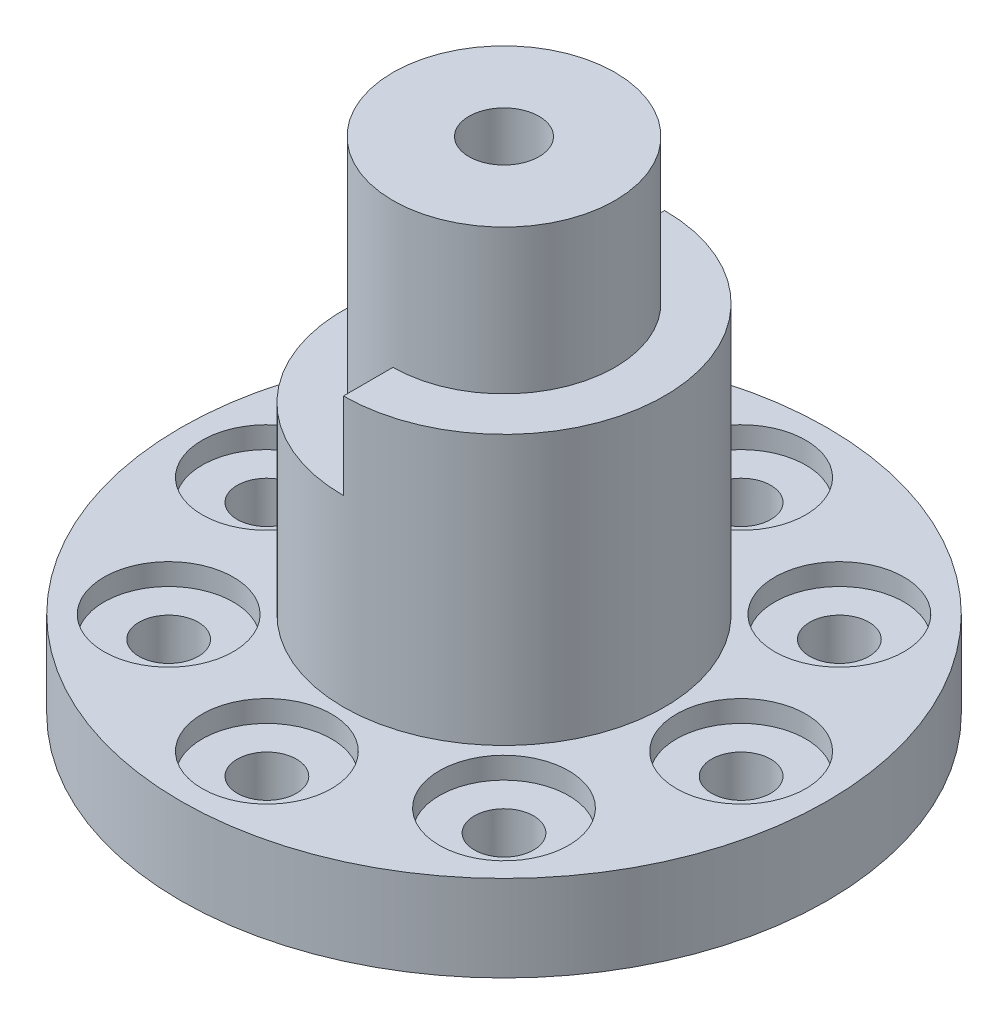
ISO-10303-21;
HEADER;
FILE_DESCRIPTION(('STEP AP214'),'2;1');
FILE_NAME('part.step','',(''),(''),'','','');
FILE_SCHEMA(('AUTOMOTIVE_DESIGN { 1 0 10303 214 1 1 1 1 }'));
ENDSEC;
DATA;
#1=APPLICATION_CONTEXT('core data for automotive mechanical design processes');
#2=APPLICATION_PROTOCOL_DEFINITION('international standard','automotive_design',2000,#1);
#3=PRODUCT_CONTEXT('',#1,'mechanical');
#4=PRODUCT('Part','Part','',(#3));
#5=PRODUCT_RELATED_PRODUCT_CATEGORY('part','',(#4));
#6=PRODUCT_DEFINITION_FORMATION('','',#4);
#7=PRODUCT_DEFINITION_CONTEXT('part definition',#1,'design');
#8=PRODUCT_DEFINITION('design','',#6,#7);
#9=PRODUCT_DEFINITION_SHAPE('','',#8);
#10=(LENGTH_UNIT() NAMED_UNIT(*) SI_UNIT(.MILLI.,.METRE.));
#11=(NAMED_UNIT(*) PLANE_ANGLE_UNIT() SI_UNIT($,.RADIAN.));
#12=(NAMED_UNIT(*) SI_UNIT($,.STERADIAN.) SOLID_ANGLE_UNIT());
#13=UNCERTAINTY_MEASURE_WITH_UNIT(LENGTH_MEASURE(1.E-05),#10,'distance_accuracy_value','');
#14=(GEOMETRIC_REPRESENTATION_CONTEXT(3) GLOBAL_UNCERTAINTY_ASSIGNED_CONTEXT((#13)) GLOBAL_UNIT_ASSIGNED_CONTEXT((#10,
#11,#12)) REPRESENTATION_CONTEXT('',''));
#15=CARTESIAN_POINT('',(0.,0.,0.));
#16=DIRECTION('',(0.,0.,1.));
#17=DIRECTION('',(1.,0.,0.));
#18=AXIS2_PLACEMENT_3D('',#15,#16,#17);
#19=CARTESIAN_POINT('',(0.,5.,0.));
#20=DIRECTION('',(0.,1.,0.));
#21=DIRECTION('',(0.,0.,1.));
#22=AXIS2_PLACEMENT_3D('',#19,#20,#21);
#23=PLANE('',#22);
#24=DIRECTION('',(0.,0.,1.));
#25=VECTOR('',#24,1.);
#26=CARTESIAN_POINT('',(0.,5.,0.));
#27=LINE('',#26,#25);
#28=CARTESIAN_POINT('',(0.,5.,-7.45));
#29=VERTEX_POINT('',#28);
#30=CARTESIAN_POINT('',(0.,5.,-5.15));
#31=VERTEX_POINT('',#30);
#32=EDGE_CURVE('E114',#29,#31,#27,.T.);
#33=ORIENTED_EDGE('',*,*,#32,.F.);
#34=CARTESIAN_POINT('',(0.,5.,0.));
#35=DIRECTION('',(0.,1.,0.));
#36=DIRECTION('',(0.,0.,1.));
#37=AXIS2_PLACEMENT_3D('',#34,#35,#36);
#38=CIRCLE('',#37,7.45);
#39=CARTESIAN_POINT('',(0.,5.,7.45));
#40=VERTEX_POINT('',#39);
#41=EDGE_CURVE('E98',#29,#40,#38,.T.);
#42=ORIENTED_EDGE('',*,*,#41,.T.);
#43=CARTESIAN_POINT('',(0.,5.,5.15));
#44=VERTEX_POINT('',#43);
#45=EDGE_CURVE('E96',#44,#40,#27,.T.);
#46=ORIENTED_EDGE('',*,*,#45,.F.);
#47=CARTESIAN_POINT('',(0.,5.,0.));
#48=DIRECTION('',(0.,1.,0.));
#49=DIRECTION('',(0.,0.,1.));
#50=AXIS2_PLACEMENT_3D('',#47,#48,#49);
#51=CIRCLE('',#50,5.15);
#52=EDGE_CURVE('E11',#44,#31,#51,.F.);
#53=ORIENTED_EDGE('',*,*,#52,.T.);
#54=EDGE_LOOP('',(#33,#42,#46,#53));
#55=FACE_BOUND('',#54,.T.);
#56=ADVANCED_FACE('F40',(#55),#23,.T.);
#57=CARTESIAN_POINT('',(0.,9.,0.));
#58=DIRECTION('',(1.,0.,0.));
#59=DIRECTION('',(0.,0.,-1.));
#60=AXIS2_PLACEMENT_3D('',#57,#58,#59);
#61=PLANE('',#60);
#62=DIRECTION('',(0.,1.,0.));
#63=VECTOR('',#62,1.);
#64=CARTESIAN_POINT('',(0.,-3.5,-7.45));
#65=LINE('',#64,#63);
#66=CARTESIAN_POINT('',(0.,9.,-7.45));
#67=VERTEX_POINT('',#66);
#68=EDGE_CURVE('E57',#29,#67,#65,.T.);
#69=ORIENTED_EDGE('',*,*,#68,.F.);
#70=ORIENTED_EDGE('',*,*,#32,.T.);
#71=DIRECTION('',(0.,-1.,0.));
#72=VECTOR('',#71,1.);
#73=CARTESIAN_POINT('',(0.,9.,-5.15));
#74=LINE('',#73,#72);
#75=CARTESIAN_POINT('',(0.,9.,-5.15));
#76=VERTEX_POINT('',#75);
#77=EDGE_CURVE('E108',#76,#31,#74,.T.);
#78=ORIENTED_EDGE('',*,*,#77,.F.);
#79=DIRECTION('',(0.,0.,1.));
#80=VECTOR('',#79,1.);
#81=CARTESIAN_POINT('',(0.,9.,0.));
#82=LINE('',#81,#80);
#83=EDGE_CURVE('E64',#67,#76,#82,.T.);
#84=ORIENTED_EDGE('',*,*,#83,.F.);
#85=EDGE_LOOP('',(#69,#70,#78,#84));
#86=FACE_BOUND('',#85,.T.);
#87=ADVANCED_FACE('F315',(#86),#61,.F.);
#88=DIRECTION('',(0.,1.,0.));
#89=VECTOR('',#88,1.);
#90=CARTESIAN_POINT('',(0.,-3.5,7.45));
#91=LINE('',#90,#89);
#92=CARTESIAN_POINT('',(0.,9.,7.45));
#93=VERTEX_POINT('',#92);
#94=EDGE_CURVE('E83',#93,#40,#91,.F.);
#95=ORIENTED_EDGE('',*,*,#94,.F.);
#96=CARTESIAN_POINT('',(0.,9.,5.15));
#97=VERTEX_POINT('',#96);
#98=EDGE_CURVE('E93',#97,#93,#82,.T.);
#99=ORIENTED_EDGE('',*,*,#98,.F.);
#100=DIRECTION('',(0.,-1.,0.));
#101=VECTOR('',#100,1.);
#102=CARTESIAN_POINT('',(0.,9.,5.15));
#103=LINE('',#102,#101);
#104=EDGE_CURVE('E104',#97,#44,#103,.T.);
#105=ORIENTED_EDGE('',*,*,#104,.T.);
#106=ORIENTED_EDGE('',*,*,#45,.T.);
#107=EDGE_LOOP('',(#95,#99,#105,#106));
#108=FACE_BOUND('',#107,.T.);
#109=ADVANCED_FACE('F92',(#108),#61,.F.);
#110=CARTESIAN_POINT('',(0.,9.,0.));
#111=DIRECTION('',(0.,1.,0.));
#112=DIRECTION('',(0.,0.,1.));
#113=AXIS2_PLACEMENT_3D('',#110,#111,#112);
#114=PLANE('',#113);
#115=ORIENTED_EDGE('',*,*,#98,.T.);
#116=CARTESIAN_POINT('',(0.,9.,0.));
#117=DIRECTION('',(0.,1.,0.));
#118=DIRECTION('',(0.,0.,1.));
#119=AXIS2_PLACEMENT_3D('',#116,#117,#118);
#120=CIRCLE('',#119,7.45);
#121=EDGE_CURVE('E80',#93,#67,#120,.T.);
#122=ORIENTED_EDGE('',*,*,#121,.T.);
#123=ORIENTED_EDGE('',*,*,#83,.T.);
#124=CARTESIAN_POINT('',(0.,9.,0.));
#125=DIRECTION('',(0.,1.,0.));
#126=DIRECTION('',(0.,0.,1.));
#127=AXIS2_PLACEMENT_3D('',#124,#125,#126);
#128=CIRCLE('',#127,5.15);
#129=EDGE_CURVE('E102',#76,#97,#128,.F.);
#130=ORIENTED_EDGE('',*,*,#129,.T.);
#131=EDGE_LOOP('',(#115,#122,#123,#130));
#132=FACE_BOUND('',#131,.T.);
#133=ADVANCED_FACE('F100',(#132),#114,.T.);
#134=CARTESIAN_POINT('',(-7.77817459305212,-7.5,-7.77817459305193));
#135=DIRECTION('',(0.,1.,0.));
#136=DIRECTION('',(0.,0.,1.));
#137=AXIS2_PLACEMENT_3D('',#134,#135,#136);
#138=CYLINDRICAL_SURFACE('',#137,1.375);
#139=CARTESIAN_POINT('',(-7.77817459305212,-7.5,-7.77817459305193));
#140=DIRECTION('',(0.,-1.,0.));
#141=DIRECTION('',(0.,0.,-1.));
#142=AXIS2_PLACEMENT_3D('',#139,#140,#141);
#143=CIRCLE('',#142,1.375);
#144=CARTESIAN_POINT('',(-7.77817459305212,-7.5,-9.15317459305193));
#145=VERTEX_POINT('',#144);
#146=EDGE_CURVE('E191',#145,#145,#143,.T.);
#147=ORIENTED_EDGE('',*,*,#146,.T.);
#148=EDGE_LOOP('',(#147));
#149=FACE_BOUND('',#148,.T.);
#150=CARTESIAN_POINT('',(-7.77817459305212,-4.5,-7.77817459305193));
#151=DIRECTION('',(0.,1.,0.));
#152=DIRECTION('',(0.,0.,1.));
#153=AXIS2_PLACEMENT_3D('',#150,#151,#152);
#154=CIRCLE('',#153,1.375);
#155=CARTESIAN_POINT('',(-7.77817459305212,-4.5,-6.40317459305193));
#156=VERTEX_POINT('',#155);
#157=EDGE_CURVE('E43',#156,#156,#154,.T.);
#158=ORIENTED_EDGE('',*,*,#157,.T.);
#159=EDGE_LOOP('',(#158));
#160=FACE_BOUND('',#159,.T.);
#161=ADVANCED_FACE('F343',(#149,#160),#138,.F.);
#162=CARTESIAN_POINT('',(-11.,-7.5,0.));
#163=DIRECTION('',(0.,1.,0.));
#164=DIRECTION('',(0.,0.,1.));
#165=AXIS2_PLACEMENT_3D('',#162,#163,#164);
#166=CYLINDRICAL_SURFACE('',#165,1.375);
#167=CARTESIAN_POINT('',(-11.,-7.5,0.));
#168=DIRECTION('',(0.,-1.,0.));
#169=DIRECTION('',(0.,0.,-1.));
#170=AXIS2_PLACEMENT_3D('',#167,#168,#169);
#171=CIRCLE('',#170,1.375);
#172=CARTESIAN_POINT('',(-11.,-7.5,-1.375));
#173=VERTEX_POINT('',#172);
#174=EDGE_CURVE('E196',#173,#173,#171,.T.);
#175=ORIENTED_EDGE('',*,*,#174,.T.);
#176=EDGE_LOOP('',(#175));
#177=FACE_BOUND('',#176,.T.);
#178=CARTESIAN_POINT('',(-11.,-4.5,0.));
#179=DIRECTION('',(0.,1.,0.));
#180=DIRECTION('',(0.,0.,1.));
#181=AXIS2_PLACEMENT_3D('',#178,#179,#180);
#182=CIRCLE('',#181,1.375);
#183=CARTESIAN_POINT('',(-11.,-4.5,1.375));
#184=VERTEX_POINT('',#183);
#185=EDGE_CURVE('E157',#184,#184,#182,.T.);
#186=ORIENTED_EDGE('',*,*,#185,.T.);
#187=EDGE_LOOP('',(#186));
#188=FACE_BOUND('',#187,.T.);
#189=ADVANCED_FACE('F373',(#177,#188),#166,.F.);
#190=CARTESIAN_POINT('',(-7.77817459305201,-7.5,7.77817459305203));
#191=DIRECTION('',(0.,1.,0.));
#192=DIRECTION('',(0.,0.,1.));
#193=AXIS2_PLACEMENT_3D('',#190,#191,#192);
#194=CYLINDRICAL_SURFACE('',#193,1.375);
#195=CARTESIAN_POINT('',(-7.77817459305201,-7.5,7.77817459305203));
#196=DIRECTION('',(0.,-1.,0.));
#197=DIRECTION('',(0.,0.,-1.));
#198=AXIS2_PLACEMENT_3D('',#195,#196,#197);
#199=CIRCLE('',#198,1.375);
#200=CARTESIAN_POINT('',(-7.77817459305201,-7.5,6.40317459305204));
#201=VERTEX_POINT('',#200);
#202=EDGE_CURVE('E202',#201,#201,#199,.T.);
#203=ORIENTED_EDGE('',*,*,#202,.T.);
#204=EDGE_LOOP('',(#203));
#205=FACE_BOUND('',#204,.T.);
#206=CARTESIAN_POINT('',(-7.77817459305201,-4.5,7.77817459305203));
#207=DIRECTION('',(0.,1.,0.));
#208=DIRECTION('',(0.,0.,1.));
#209=AXIS2_PLACEMENT_3D('',#206,#207,#208);
#210=CIRCLE('',#209,1.375);
#211=CARTESIAN_POINT('',(-7.77817459305201,-4.5,9.15317459305203));
#212=VERTEX_POINT('',#211);
#213=EDGE_CURVE('E154',#212,#212,#210,.T.);
#214=ORIENTED_EDGE('',*,*,#213,.T.);
#215=EDGE_LOOP('',(#214));
#216=FACE_BOUND('',#215,.T.);
#217=ADVANCED_FACE('F369',(#205,#216),#194,.F.);
#218=CARTESIAN_POINT('',(0.,-7.5,11.));
#219=DIRECTION('',(0.,1.,0.));
#220=DIRECTION('',(0.,0.,1.));
#221=AXIS2_PLACEMENT_3D('',#218,#219,#220);
#222=CYLINDRICAL_SURFACE('',#221,1.375);
#223=CARTESIAN_POINT('',(0.,-7.5,11.));
#224=DIRECTION('',(0.,-1.,0.));
#225=DIRECTION('',(0.,0.,-1.));
#226=AXIS2_PLACEMENT_3D('',#223,#224,#225);
#227=CIRCLE('',#226,1.375);
#228=CARTESIAN_POINT('',(0.,-7.5,9.625));
#229=VERTEX_POINT('',#228);
#230=EDGE_CURVE('E206',#229,#229,#227,.T.);
#231=ORIENTED_EDGE('',*,*,#230,.T.);
#232=EDGE_LOOP('',(#231));
#233=FACE_BOUND('',#232,.T.);
#234=CARTESIAN_POINT('',(0.,-4.5,11.));
#235=DIRECTION('',(0.,1.,0.));
#236=DIRECTION('',(0.,0.,1.));
#237=AXIS2_PLACEMENT_3D('',#234,#235,#236);
#238=CIRCLE('',#237,1.375);
#239=CARTESIAN_POINT('',(0.,-4.5,12.375));
#240=VERTEX_POINT('',#239);
#241=EDGE_CURVE('E150',#240,#240,#238,.T.);
#242=ORIENTED_EDGE('',*,*,#241,.T.);
#243=EDGE_LOOP('',(#242));
#244=FACE_BOUND('',#243,.T.);
#245=ADVANCED_FACE('F365',(#233,#244),#222,.F.);
#246=CARTESIAN_POINT('',(7.77817459305206,-7.5,7.77817459305199));
#247=DIRECTION('',(0.,1.,0.));
#248=DIRECTION('',(0.,0.,1.));
#249=AXIS2_PLACEMENT_3D('',#246,#247,#248);
#250=CYLINDRICAL_SURFACE('',#249,1.375);
#251=CARTESIAN_POINT('',(7.77817459305206,-7.5,7.77817459305199));
#252=DIRECTION('',(0.,-1.,0.));
#253=DIRECTION('',(0.,0.,-1.));
#254=AXIS2_PLACEMENT_3D('',#251,#252,#253);
#255=CIRCLE('',#254,1.375);
#256=CARTESIAN_POINT('',(7.77817459305206,-7.5,6.40317459305199));
#257=VERTEX_POINT('',#256);
#258=EDGE_CURVE('E210',#257,#257,#255,.T.);
#259=ORIENTED_EDGE('',*,*,#258,.T.);
#260=EDGE_LOOP('',(#259));
#261=FACE_BOUND('',#260,.T.);
#262=CARTESIAN_POINT('',(7.77817459305206,-4.5,7.77817459305199));
#263=DIRECTION('',(0.,1.,0.));
#264=DIRECTION('',(0.,0.,1.));
#265=AXIS2_PLACEMENT_3D('',#262,#263,#264);
#266=CIRCLE('',#265,1.375);
#267=CARTESIAN_POINT('',(7.77817459305206,-4.5,9.15317459305198));
#268=VERTEX_POINT('',#267);
#269=EDGE_CURVE('E146',#268,#268,#266,.T.);
#270=ORIENTED_EDGE('',*,*,#269,.T.);
#271=EDGE_LOOP('',(#270));
#272=FACE_BOUND('',#271,.T.);
#273=ADVANCED_FACE('F361',(#261,#272),#250,.F.);
#274=CARTESIAN_POINT('',(11.,-7.5,0.));
#275=DIRECTION('',(0.,1.,0.));
#276=DIRECTION('',(0.,0.,1.));
#277=AXIS2_PLACEMENT_3D('',#274,#275,#276);
#278=CYLINDRICAL_SURFACE('',#277,1.375);
#279=CARTESIAN_POINT('',(11.,-7.5,0.));
#280=DIRECTION('',(0.,-1.,0.));
#281=DIRECTION('',(0.,0.,-1.));
#282=AXIS2_PLACEMENT_3D('',#279,#280,#281);
#283=CIRCLE('',#282,1.375);
#284=CARTESIAN_POINT('',(11.,-7.5,-1.37500000000008));
#285=VERTEX_POINT('',#284);
#286=EDGE_CURVE('E214',#285,#285,#283,.T.);
#287=ORIENTED_EDGE('',*,*,#286,.T.);
#288=EDGE_LOOP('',(#287));
#289=FACE_BOUND('',#288,.T.);
#290=CARTESIAN_POINT('',(11.,-4.5,0.));
#291=DIRECTION('',(0.,1.,0.));
#292=DIRECTION('',(0.,0.,1.));
#293=AXIS2_PLACEMENT_3D('',#290,#291,#292);
#294=CIRCLE('',#293,1.375);
#295=CARTESIAN_POINT('',(11.,-4.5,1.37499999999992));
#296=VERTEX_POINT('',#295);
#297=EDGE_CURVE('E142',#296,#296,#294,.T.);
#298=ORIENTED_EDGE('',*,*,#297,.T.);
#299=EDGE_LOOP('',(#298));
#300=FACE_BOUND('',#299,.T.);
#301=ADVANCED_FACE('F357',(#289,#300),#278,.F.);
#302=CARTESIAN_POINT('',(7.77817459305195,-7.5,-7.77817459305209));
#303=DIRECTION('',(0.,1.,0.));
#304=DIRECTION('',(0.,0.,1.));
#305=AXIS2_PLACEMENT_3D('',#302,#303,#304);
#306=CYLINDRICAL_SURFACE('',#305,1.375);
#307=CARTESIAN_POINT('',(7.77817459305195,-7.5,-7.77817459305209));
#308=DIRECTION('',(0.,-1.,0.));
#309=DIRECTION('',(0.,0.,-1.));
#310=AXIS2_PLACEMENT_3D('',#307,#308,#309);
#311=CIRCLE('',#310,1.375);
#312=CARTESIAN_POINT('',(7.77817459305195,-7.5,-9.15317459305209));
#313=VERTEX_POINT('',#312);
#314=EDGE_CURVE('E175',#313,#313,#311,.T.);
#315=ORIENTED_EDGE('',*,*,#314,.T.);
#316=EDGE_LOOP('',(#315));
#317=FACE_BOUND('',#316,.T.);
#318=CARTESIAN_POINT('',(7.77817459305195,-4.5,-7.77817459305209));
#319=DIRECTION('',(0.,1.,0.));
#320=DIRECTION('',(0.,0.,1.));
#321=AXIS2_PLACEMENT_3D('',#318,#319,#320);
#322=CIRCLE('',#321,1.375);
#323=CARTESIAN_POINT('',(7.77817459305195,-4.5,-6.40317459305209));
#324=VERTEX_POINT('',#323);
#325=EDGE_CURVE('E137',#324,#324,#322,.T.);
#326=ORIENTED_EDGE('',*,*,#325,.T.);
#327=EDGE_LOOP('',(#326));
#328=FACE_BOUND('',#327,.T.);
#329=ADVANCED_FACE('F353',(#317,#328),#306,.F.);
#330=CARTESIAN_POINT('',(-1.15218884181823E-13,-7.5,-11.));
#331=DIRECTION('',(0.,1.,0.));
#332=DIRECTION('',(0.,0.,1.));
#333=AXIS2_PLACEMENT_3D('',#330,#331,#332);
#334=CYLINDRICAL_SURFACE('',#333,1.375);
#335=CARTESIAN_POINT('',(-1.15218884181823E-13,-7.5,-11.));
#336=DIRECTION('',(0.,-1.,0.));
#337=DIRECTION('',(0.,0.,-1.));
#338=AXIS2_PLACEMENT_3D('',#335,#336,#337);
#339=CIRCLE('',#338,1.375);
#340=CARTESIAN_POINT('',(-1.15218884181823E-13,-7.5,-12.375));
#341=VERTEX_POINT('',#340);
#342=EDGE_CURVE('E169',#341,#341,#339,.T.);
#343=ORIENTED_EDGE('',*,*,#342,.T.);
#344=EDGE_LOOP('',(#343));
#345=FACE_BOUND('',#344,.T.);
#346=CARTESIAN_POINT('',(-1.15218884181823E-13,-4.5,-11.));
#347=DIRECTION('',(0.,1.,0.));
#348=DIRECTION('',(0.,0.,1.));
#349=AXIS2_PLACEMENT_3D('',#346,#347,#348);
#350=CIRCLE('',#349,1.375);
#351=CARTESIAN_POINT('',(-1.15218884181823E-13,-4.5,-9.625));
#352=VERTEX_POINT('',#351);
#353=EDGE_CURVE('E133',#352,#352,#350,.T.);
#354=ORIENTED_EDGE('',*,*,#353,.T.);
#355=EDGE_LOOP('',(#354));
#356=FACE_BOUND('',#355,.T.);
#357=ADVANCED_FACE('F337',(#345,#356),#334,.F.);
#358=CARTESIAN_POINT('',(0.,37.,0.));
#359=DIRECTION('',(0.,-1.,0.));
#360=DIRECTION('',(0.,0.,-1.));
#361=AXIS2_PLACEMENT_3D('',#358,#359,#360);
#362=CYLINDRICAL_SURFACE('',#361,1.625);
#363=CARTESIAN_POINT('',(0.,15.7,0.));
#364=DIRECTION('',(0.,1.,0.));
#365=DIRECTION('',(0.,0.,1.));
#366=AXIS2_PLACEMENT_3D('',#363,#364,#365);
#367=CIRCLE('',#366,1.625);
#368=CARTESIAN_POINT('',(0.,15.7,1.625));
#369=VERTEX_POINT('',#368);
#370=EDGE_CURVE('E117',#369,#369,#367,.T.);
#371=ORIENTED_EDGE('',*,*,#370,.T.);
#372=EDGE_LOOP('',(#371));
#373=FACE_BOUND('',#372,.T.);
#374=CARTESIAN_POINT('',(0.,10.7,0.));
#375=DIRECTION('',(0.,-1.,0.));
#376=DIRECTION('',(0.,0.,-1.));
#377=AXIS2_PLACEMENT_3D('',#374,#375,#376);
#378=CIRCLE('',#377,1.625);
#379=CARTESIAN_POINT('',(0.,10.7,-1.625));
#380=VERTEX_POINT('',#379);
#381=EDGE_CURVE('E128',#380,#380,#378,.F.);
#382=ORIENTED_EDGE('',*,*,#381,.F.);
#383=EDGE_LOOP('',(#382));
#384=FACE_BOUND('',#383,.T.);
#385=ADVANCED_FACE('F328',(#373,#384),#362,.F.);
#386=CARTESIAN_POINT('',(0.,15.7,0.));
#387=DIRECTION('',(0.,-1.,0.));
#388=DIRECTION('',(0.,0.,-1.));
#389=AXIS2_PLACEMENT_3D('',#386,#387,#388);
#390=CYLINDRICAL_SURFACE('',#389,5.15);
#391=CARTESIAN_POINT('',(0.,15.7,0.));
#392=DIRECTION('',(0.,1.,0.));
#393=DIRECTION('',(0.,0.,1.));
#394=AXIS2_PLACEMENT_3D('',#391,#392,#393);
#395=CIRCLE('',#394,5.15);
#396=CARTESIAN_POINT('',(0.,15.7,5.15));
#397=VERTEX_POINT('',#396);
#398=EDGE_CURVE('E49',#397,#397,#395,.T.);
#399=ORIENTED_EDGE('',*,*,#398,.F.);
#400=EDGE_LOOP('',(#399));
#401=FACE_BOUND('',#400,.T.);
#402=ORIENTED_EDGE('',*,*,#77,.T.);
#403=ORIENTED_EDGE('',*,*,#52,.F.);
#404=ORIENTED_EDGE('',*,*,#104,.F.);
#405=ORIENTED_EDGE('',*,*,#129,.F.);
#406=EDGE_LOOP('',(#402,#403,#404,#405));
#407=FACE_BOUND('',#406,.T.);
#408=ADVANCED_FACE('F325',(#401,#407),#390,.T.);
#409=CARTESIAN_POINT('',(0.,15.7,0.));
#410=DIRECTION('',(0.,1.,0.));
#411=DIRECTION('',(0.,0.,1.));
#412=AXIS2_PLACEMENT_3D('',#409,#410,#411);
#413=PLANE('',#412);
#414=ORIENTED_EDGE('',*,*,#370,.F.);
#415=EDGE_LOOP('',(#414));
#416=FACE_BOUND('',#415,.T.);
#417=ORIENTED_EDGE('',*,*,#398,.T.);
#418=EDGE_LOOP('',(#417));
#419=FACE_BOUND('',#418,.T.);
#420=ADVANCED_FACE('F327',(#416,#419),#413,.T.);
#421=CARTESIAN_POINT('',(0.,10.7,0.));
#422=DIRECTION('',(0.,-1.,0.));
#423=DIRECTION('',(0.,0.,-1.));
#424=AXIS2_PLACEMENT_3D('',#421,#422,#423);
#425=PLANE('',#424);
#426=CARTESIAN_POINT('',(0.,10.7,0.));
#427=DIRECTION('',(0.,-1.,0.));
#428=DIRECTION('',(0.,0.,-1.));
#429=AXIS2_PLACEMENT_3D('',#426,#427,#428);
#430=CIRCLE('',#429,3.5);
#431=CARTESIAN_POINT('',(0.,10.7,-3.5));
#432=VERTEX_POINT('',#431);
#433=EDGE_CURVE('E132',#432,#432,#430,.T.);
#434=ORIENTED_EDGE('',*,*,#433,.T.);
#435=EDGE_LOOP('',(#434));
#436=FACE_BOUND('',#435,.T.);
#437=ORIENTED_EDGE('',*,*,#381,.T.);
#438=EDGE_LOOP('',(#437));
#439=FACE_BOUND('',#438,.T.);
#440=ADVANCED_FACE('F333',(#436,#439),#425,.T.);
#441=CARTESIAN_POINT('',(0.,10.7,0.));
#442=DIRECTION('',(0.,-1.,0.));
#443=DIRECTION('',(0.,0.,-1.));
#444=AXIS2_PLACEMENT_3D('',#441,#442,#443);
#445=CYLINDRICAL_SURFACE('',#444,3.5);
#446=ORIENTED_EDGE('',*,*,#433,.F.);
#447=EDGE_LOOP('',(#446));
#448=FACE_BOUND('',#447,.T.);
#449=CARTESIAN_POINT('',(0.,-7.5,0.));
#450=DIRECTION('',(0.,-1.,0.));
#451=DIRECTION('',(0.,0.,-1.));
#452=AXIS2_PLACEMENT_3D('',#449,#450,#451);
#453=CIRCLE('',#452,3.5);
#454=CARTESIAN_POINT('',(0.,-7.5,-3.5));
#455=VERTEX_POINT('',#454);
#456=EDGE_CURVE('E186',#455,#455,#453,.F.);
#457=ORIENTED_EDGE('',*,*,#456,.F.);
#458=EDGE_LOOP('',(#457));
#459=FACE_BOUND('',#458,.T.);
#460=ADVANCED_FACE('F345',(#448,#459),#445,.F.);
#461=CARTESIAN_POINT('',(0.,-7.5,0.));
#462=DIRECTION('',(0.,1.,0.));
#463=DIRECTION('',(0.,0.,1.));
#464=AXIS2_PLACEMENT_3D('',#461,#462,#463);
#465=CYLINDRICAL_SURFACE('',#464,15.);
#466=CARTESIAN_POINT('',(0.,-7.5,0.));
#467=DIRECTION('',(0.,-1.,0.));
#468=DIRECTION('',(0.,0.,-1.));
#469=AXIS2_PLACEMENT_3D('',#466,#467,#468);
#470=CIRCLE('',#469,15.);
#471=CARTESIAN_POINT('',(0.,-7.5,-15.));
#472=VERTEX_POINT('',#471);
#473=EDGE_CURVE('E178',#472,#472,#470,.T.);
#474=ORIENTED_EDGE('',*,*,#473,.F.);
#475=EDGE_LOOP('',(#474));
#476=FACE_BOUND('',#475,.T.);
#477=CARTESIAN_POINT('',(0.,-3.5,0.));
#478=DIRECTION('',(0.,-1.,0.));
#479=DIRECTION('',(0.,0.,-1.));
#480=AXIS2_PLACEMENT_3D('',#477,#478,#479);
#481=CIRCLE('',#480,15.);
#482=CARTESIAN_POINT('',(0.,-3.5,-15.));
#483=VERTEX_POINT('',#482);
#484=EDGE_CURVE('E164',#483,#483,#481,.T.);
#485=ORIENTED_EDGE('',*,*,#484,.T.);
#486=EDGE_LOOP('',(#485));
#487=FACE_BOUND('',#486,.T.);
#488=ADVANCED_FACE('F308',(#476,#487),#465,.T.);
#489=CARTESIAN_POINT('',(0.,-7.5,0.));
#490=DIRECTION('',(0.,-1.,0.));
#491=DIRECTION('',(0.,0.,-1.));
#492=AXIS2_PLACEMENT_3D('',#489,#490,#491);
#493=PLANE('',#492);
#494=ORIENTED_EDGE('',*,*,#342,.F.);
#495=EDGE_LOOP('',(#494));
#496=FACE_BOUND('',#495,.T.);
#497=ORIENTED_EDGE('',*,*,#314,.F.);
#498=EDGE_LOOP('',(#497));
#499=FACE_BOUND('',#498,.T.);
#500=ORIENTED_EDGE('',*,*,#286,.F.);
#501=EDGE_LOOP('',(#500));
#502=FACE_BOUND('',#501,.T.);
#503=ORIENTED_EDGE('',*,*,#258,.F.);
#504=EDGE_LOOP('',(#503));
#505=FACE_BOUND('',#504,.T.);
#506=ORIENTED_EDGE('',*,*,#230,.F.);
#507=EDGE_LOOP('',(#506));
#508=FACE_BOUND('',#507,.T.);
#509=ORIENTED_EDGE('',*,*,#202,.F.);
#510=EDGE_LOOP('',(#509));
#511=FACE_BOUND('',#510,.T.);
#512=ORIENTED_EDGE('',*,*,#174,.F.);
#513=EDGE_LOOP('',(#512));
#514=FACE_BOUND('',#513,.T.);
#515=ORIENTED_EDGE('',*,*,#146,.F.);
#516=EDGE_LOOP('',(#515));
#517=FACE_BOUND('',#516,.T.);
#518=ORIENTED_EDGE('',*,*,#456,.T.);
#519=EDGE_LOOP('',(#518));
#520=FACE_BOUND('',#519,.T.);
#521=ORIENTED_EDGE('',*,*,#473,.T.);
#522=EDGE_LOOP('',(#521));
#523=FACE_BOUND('',#522,.T.);
#524=ADVANCED_FACE('F296',(#496,#499,#502,#505,#508,#511,#514,#517,#520,#523),#493,.T.);
#525=CARTESIAN_POINT('',(0.,-3.5,0.));
#526=DIRECTION('',(0.,-1.,0.));
#527=DIRECTION('',(0.,0.,-1.));
#528=AXIS2_PLACEMENT_3D('',#525,#526,#527);
#529=PLANE('',#528);
#530=CARTESIAN_POINT('',(-7.77817459305212,-3.5,7.77817459305193));
#531=DIRECTION('',(0.,1.,0.));
#532=DIRECTION('',(0.,0.,1.));
#533=AXIS2_PLACEMENT_3D('',#530,#531,#532);
#534=CIRCLE('',#533,3.);
#535=CARTESIAN_POINT('',(-7.77817459305212,-3.5,10.7781745930519));
#536=VERTEX_POINT('',#535);
#537=EDGE_CURVE('E229',#536,#536,#534,.T.);
#538=ORIENTED_EDGE('',*,*,#537,.F.);
#539=EDGE_LOOP('',(#538));
#540=FACE_BOUND('',#539,.T.);
#541=CARTESIAN_POINT('',(-1.15218884181823E-13,-3.5,11.));
#542=DIRECTION('',(0.,1.,0.));
#543=DIRECTION('',(0.,0.,1.));
#544=AXIS2_PLACEMENT_3D('',#541,#542,#543);
#545=CIRCLE('',#544,3.);
#546=CARTESIAN_POINT('',(-1.15218884181823E-13,-3.5,14.));
#547=VERTEX_POINT('',#546);
#548=EDGE_CURVE('E237',#547,#547,#545,.T.);
#549=ORIENTED_EDGE('',*,*,#548,.F.);
#550=EDGE_LOOP('',(#549));
#551=FACE_BOUND('',#550,.T.);
#552=CARTESIAN_POINT('',(7.77817459305195,-3.5,7.77817459305209));
#553=DIRECTION('',(0.,1.,0.));
#554=DIRECTION('',(0.,0.,1.));
#555=AXIS2_PLACEMENT_3D('',#552,#553,#554);
#556=CIRCLE('',#555,3.);
#557=CARTESIAN_POINT('',(7.77817459305195,-3.5,10.7781745930521));
#558=VERTEX_POINT('',#557);
#559=EDGE_CURVE('E245',#558,#558,#556,.T.);
#560=ORIENTED_EDGE('',*,*,#559,.F.);
#561=EDGE_LOOP('',(#560));
#562=FACE_BOUND('',#561,.T.);
#563=CARTESIAN_POINT('',(11.,-3.5,0.));
#564=DIRECTION('',(0.,1.,0.));
#565=DIRECTION('',(0.,0.,1.));
#566=AXIS2_PLACEMENT_3D('',#563,#564,#565);
#567=CIRCLE('',#566,3.);
#568=CARTESIAN_POINT('',(11.,-3.5,3.00000000000008));
#569=VERTEX_POINT('',#568);
#570=EDGE_CURVE('E253',#569,#569,#567,.T.);
#571=ORIENTED_EDGE('',*,*,#570,.F.);
#572=EDGE_LOOP('',(#571));
#573=FACE_BOUND('',#572,.T.);
#574=CARTESIAN_POINT('',(7.77817459305206,-3.5,-7.77817459305199));
#575=DIRECTION('',(0.,1.,0.));
#576=DIRECTION('',(0.,0.,1.));
#577=AXIS2_PLACEMENT_3D('',#574,#575,#576);
#578=CIRCLE('',#577,3.);
#579=CARTESIAN_POINT('',(7.77817459305206,-3.5,-4.77817459305199));
#580=VERTEX_POINT('',#579);
#581=EDGE_CURVE('E261',#580,#580,#578,.T.);
#582=ORIENTED_EDGE('',*,*,#581,.F.);
#583=EDGE_LOOP('',(#582));
#584=FACE_BOUND('',#583,.T.);
#585=CARTESIAN_POINT('',(0.,-3.5,-11.));
#586=DIRECTION('',(0.,1.,0.));
#587=DIRECTION('',(0.,0.,1.));
#588=AXIS2_PLACEMENT_3D('',#585,#586,#587);
#589=CIRCLE('',#588,3.);
#590=CARTESIAN_POINT('',(0.,-3.5,-8.));
#591=VERTEX_POINT('',#590);
#592=EDGE_CURVE('E269',#591,#591,#589,.T.);
#593=ORIENTED_EDGE('',*,*,#592,.F.);
#594=EDGE_LOOP('',(#593));
#595=FACE_BOUND('',#594,.T.);
#596=CARTESIAN_POINT('',(-7.77817459305201,-3.5,-7.77817459305203));
#597=DIRECTION('',(0.,1.,0.));
#598=DIRECTION('',(0.,0.,1.));
#599=AXIS2_PLACEMENT_3D('',#596,#597,#598);
#600=CIRCLE('',#599,3.);
#601=CARTESIAN_POINT('',(-7.77817459305201,-3.5,-4.77817459305204));
#602=VERTEX_POINT('',#601);
#603=EDGE_CURVE('E277',#602,#602,#600,.T.);
#604=ORIENTED_EDGE('',*,*,#603,.F.);
#605=EDGE_LOOP('',(#604));
#606=FACE_BOUND('',#605,.T.);
#607=CARTESIAN_POINT('',(-11.,-3.5,0.));
#608=DIRECTION('',(0.,1.,0.));
#609=DIRECTION('',(0.,0.,1.));
#610=AXIS2_PLACEMENT_3D('',#607,#608,#609);
#611=CIRCLE('',#610,3.);
#612=CARTESIAN_POINT('',(-11.,-3.5,3.));
#613=VERTEX_POINT('',#612);
#614=EDGE_CURVE('E221',#613,#613,#611,.T.);
#615=ORIENTED_EDGE('',*,*,#614,.F.);
#616=EDGE_LOOP('',(#615));
#617=FACE_BOUND('',#616,.T.);
#618=ORIENTED_EDGE('',*,*,#484,.F.);
#619=EDGE_LOOP('',(#618));
#620=FACE_BOUND('',#619,.T.);
#621=CARTESIAN_POINT('',(0.,-3.5,0.));
#622=DIRECTION('',(0.,1.,0.));
#623=DIRECTION('',(0.,0.,1.));
#624=AXIS2_PLACEMENT_3D('',#621,#622,#623);
#625=CIRCLE('',#624,7.45);
#626=CARTESIAN_POINT('',(0.,-3.5,7.45));
#627=VERTEX_POINT('',#626);
#628=EDGE_CURVE('E87',#627,#627,#625,.T.);
#629=ORIENTED_EDGE('',*,*,#628,.F.);
#630=EDGE_LOOP('',(#629));
#631=FACE_BOUND('',#630,.T.);
#632=ADVANCED_FACE('F293',(#540,#551,#562,#573,#584,#595,#606,#617,#620,#631),#529,.F.);
#633=CARTESIAN_POINT('',(-11.,-4.5,0.));
#634=DIRECTION('',(0.,1.,0.));
#635=DIRECTION('',(0.,0.,1.));
#636=AXIS2_PLACEMENT_3D('',#633,#634,#635);
#637=CYLINDRICAL_SURFACE('',#636,3.);
#638=CARTESIAN_POINT('',(-11.,-4.5,0.));
#639=DIRECTION('',(0.,1.,0.));
#640=DIRECTION('',(0.,0.,1.));
#641=AXIS2_PLACEMENT_3D('',#638,#639,#640);
#642=CIRCLE('',#641,3.);
#643=CARTESIAN_POINT('',(-11.,-4.5,3.));
#644=VERTEX_POINT('',#643);
#645=EDGE_CURVE('E138',#644,#644,#642,.T.);
#646=ORIENTED_EDGE('',*,*,#645,.F.);
#647=EDGE_LOOP('',(#646));
#648=FACE_BOUND('',#647,.T.);
#649=ORIENTED_EDGE('',*,*,#614,.T.);
#650=EDGE_LOOP('',(#649));
#651=FACE_BOUND('',#650,.T.);
#652=ADVANCED_FACE('F295',(#648,#651),#637,.F.);
#653=CARTESIAN_POINT('',(-11.,-4.5,0.));
#654=DIRECTION('',(0.,1.,0.));
#655=DIRECTION('',(0.,0.,1.));
#656=AXIS2_PLACEMENT_3D('',#653,#654,#655);
#657=PLANE('',#656);
#658=ORIENTED_EDGE('',*,*,#185,.F.);
#659=EDGE_LOOP('',(#658));
#660=FACE_BOUND('',#659,.T.);
#661=ORIENTED_EDGE('',*,*,#645,.T.);
#662=EDGE_LOOP('',(#661));
#663=FACE_BOUND('',#662,.T.);
#664=ADVANCED_FACE('F304',(#660,#663),#657,.T.);
#665=CARTESIAN_POINT('',(-7.77817459305201,-4.5,-7.77817459305203));
#666=DIRECTION('',(0.,1.,0.));
#667=DIRECTION('',(0.,0.,1.));
#668=AXIS2_PLACEMENT_3D('',#665,#666,#667);
#669=CYLINDRICAL_SURFACE('',#668,3.);
#670=CARTESIAN_POINT('',(-7.77817459305201,-4.5,-7.77817459305203));
#671=DIRECTION('',(0.,1.,0.));
#672=DIRECTION('',(0.,0.,1.));
#673=AXIS2_PLACEMENT_3D('',#670,#671,#672);
#674=CIRCLE('',#673,3.);
#675=CARTESIAN_POINT('',(-7.77817459305201,-4.5,-4.77817459305204));
#676=VERTEX_POINT('',#675);
#677=EDGE_CURVE('E225',#676,#676,#674,.T.);
#678=ORIENTED_EDGE('',*,*,#677,.F.);
#679=EDGE_LOOP('',(#678));
#680=FACE_BOUND('',#679,.T.);
#681=ORIENTED_EDGE('',*,*,#603,.T.);
#682=EDGE_LOOP('',(#681));
#683=FACE_BOUND('',#682,.T.);
#684=ADVANCED_FACE('F402',(#680,#683),#669,.F.);
#685=CARTESIAN_POINT('',(-7.77817459305201,-4.5,-7.77817459305203));
#686=DIRECTION('',(0.,1.,0.));
#687=DIRECTION('',(0.,0.,1.));
#688=AXIS2_PLACEMENT_3D('',#685,#686,#687);
#689=PLANE('',#688);
#690=ORIENTED_EDGE('',*,*,#157,.F.);
#691=EDGE_LOOP('',(#690));
#692=FACE_BOUND('',#691,.T.);
#693=ORIENTED_EDGE('',*,*,#677,.T.);
#694=EDGE_LOOP('',(#693));
#695=FACE_BOUND('',#694,.T.);
#696=ADVANCED_FACE('F410',(#692,#695),#689,.T.);
#697=CARTESIAN_POINT('',(0.,-4.5,-11.));
#698=DIRECTION('',(0.,1.,0.));
#699=DIRECTION('',(0.,0.,1.));
#700=AXIS2_PLACEMENT_3D('',#697,#698,#699);
#701=CYLINDRICAL_SURFACE('',#700,3.);
#702=CARTESIAN_POINT('',(0.,-4.5,-11.));
#703=DIRECTION('',(0.,1.,0.));
#704=DIRECTION('',(0.,0.,1.));
#705=AXIS2_PLACEMENT_3D('',#702,#703,#704);
#706=CIRCLE('',#705,3.);
#707=CARTESIAN_POINT('',(0.,-4.5,-8.));
#708=VERTEX_POINT('',#707);
#709=EDGE_CURVE('E273',#708,#708,#706,.T.);
#710=ORIENTED_EDGE('',*,*,#709,.F.);
#711=EDGE_LOOP('',(#710));
#712=FACE_BOUND('',#711,.T.);
#713=ORIENTED_EDGE('',*,*,#592,.T.);
#714=EDGE_LOOP('',(#713));
#715=FACE_BOUND('',#714,.T.);
#716=ADVANCED_FACE('F418',(#712,#715),#701,.F.);
#717=CARTESIAN_POINT('',(0.,-4.5,-11.));
#718=DIRECTION('',(0.,1.,0.));
#719=DIRECTION('',(0.,0.,1.));
#720=AXIS2_PLACEMENT_3D('',#717,#718,#719);
#721=PLANE('',#720);
#722=ORIENTED_EDGE('',*,*,#353,.F.);
#723=EDGE_LOOP('',(#722));
#724=FACE_BOUND('',#723,.T.);
#725=ORIENTED_EDGE('',*,*,#709,.T.);
#726=EDGE_LOOP('',(#725));
#727=FACE_BOUND('',#726,.T.);
#728=ADVANCED_FACE('F426',(#724,#727),#721,.T.);
#729=CARTESIAN_POINT('',(7.77817459305206,-4.5,-7.77817459305199));
#730=DIRECTION('',(0.,1.,0.));
#731=DIRECTION('',(0.,0.,1.));
#732=AXIS2_PLACEMENT_3D('',#729,#730,#731);
#733=CYLINDRICAL_SURFACE('',#732,3.);
#734=CARTESIAN_POINT('',(7.77817459305206,-4.5,-7.77817459305199));
#735=DIRECTION('',(0.,1.,0.));
#736=DIRECTION('',(0.,0.,1.));
#737=AXIS2_PLACEMENT_3D('',#734,#735,#736);
#738=CIRCLE('',#737,3.);
#739=CARTESIAN_POINT('',(7.77817459305206,-4.5,-4.77817459305199));
#740=VERTEX_POINT('',#739);
#741=EDGE_CURVE('E265',#740,#740,#738,.T.);
#742=ORIENTED_EDGE('',*,*,#741,.F.);
#743=EDGE_LOOP('',(#742));
#744=FACE_BOUND('',#743,.T.);
#745=ORIENTED_EDGE('',*,*,#581,.T.);
#746=EDGE_LOOP('',(#745));
#747=FACE_BOUND('',#746,.T.);
#748=ADVANCED_FACE('F434',(#744,#747),#733,.F.);
#749=CARTESIAN_POINT('',(7.77817459305206,-4.5,-7.77817459305199));
#750=DIRECTION('',(0.,1.,0.));
#751=DIRECTION('',(0.,0.,1.));
#752=AXIS2_PLACEMENT_3D('',#749,#750,#751);
#753=PLANE('',#752);
#754=ORIENTED_EDGE('',*,*,#325,.F.);
#755=EDGE_LOOP('',(#754));
#756=FACE_BOUND('',#755,.T.);
#757=ORIENTED_EDGE('',*,*,#741,.T.);
#758=EDGE_LOOP('',(#757));
#759=FACE_BOUND('',#758,.T.);
#760=ADVANCED_FACE('F442',(#756,#759),#753,.T.);
#761=CARTESIAN_POINT('',(11.,-4.5,0.));
#762=DIRECTION('',(0.,1.,0.));
#763=DIRECTION('',(0.,0.,1.));
#764=AXIS2_PLACEMENT_3D('',#761,#762,#763);
#765=CYLINDRICAL_SURFACE('',#764,3.);
#766=CARTESIAN_POINT('',(11.,-4.5,0.));
#767=DIRECTION('',(0.,1.,0.));
#768=DIRECTION('',(0.,0.,1.));
#769=AXIS2_PLACEMENT_3D('',#766,#767,#768);
#770=CIRCLE('',#769,3.);
#771=CARTESIAN_POINT('',(11.,-4.5,3.00000000000008));
#772=VERTEX_POINT('',#771);
#773=EDGE_CURVE('E257',#772,#772,#770,.T.);
#774=ORIENTED_EDGE('',*,*,#773,.F.);
#775=EDGE_LOOP('',(#774));
#776=FACE_BOUND('',#775,.T.);
#777=ORIENTED_EDGE('',*,*,#570,.T.);
#778=EDGE_LOOP('',(#777));
#779=FACE_BOUND('',#778,.T.);
#780=ADVANCED_FACE('F450',(#776,#779),#765,.F.);
#781=CARTESIAN_POINT('',(11.,-4.5,0.));
#782=DIRECTION('',(0.,1.,0.));
#783=DIRECTION('',(0.,0.,1.));
#784=AXIS2_PLACEMENT_3D('',#781,#782,#783);
#785=PLANE('',#784);
#786=ORIENTED_EDGE('',*,*,#297,.F.);
#787=EDGE_LOOP('',(#786));
#788=FACE_BOUND('',#787,.T.);
#789=ORIENTED_EDGE('',*,*,#773,.T.);
#790=EDGE_LOOP('',(#789));
#791=FACE_BOUND('',#790,.T.);
#792=ADVANCED_FACE('F458',(#788,#791),#785,.T.);
#793=CARTESIAN_POINT('',(7.77817459305195,-4.5,7.77817459305209));
#794=DIRECTION('',(0.,1.,0.));
#795=DIRECTION('',(0.,0.,1.));
#796=AXIS2_PLACEMENT_3D('',#793,#794,#795);
#797=CYLINDRICAL_SURFACE('',#796,3.);
#798=CARTESIAN_POINT('',(7.77817459305195,-4.5,7.77817459305209));
#799=DIRECTION('',(0.,1.,0.));
#800=DIRECTION('',(0.,0.,1.));
#801=AXIS2_PLACEMENT_3D('',#798,#799,#800);
#802=CIRCLE('',#801,3.);
#803=CARTESIAN_POINT('',(7.77817459305195,-4.5,10.7781745930521));
#804=VERTEX_POINT('',#803);
#805=EDGE_CURVE('E249',#804,#804,#802,.T.);
#806=ORIENTED_EDGE('',*,*,#805,.F.);
#807=EDGE_LOOP('',(#806));
#808=FACE_BOUND('',#807,.T.);
#809=ORIENTED_EDGE('',*,*,#559,.T.);
#810=EDGE_LOOP('',(#809));
#811=FACE_BOUND('',#810,.T.);
#812=ADVANCED_FACE('F466',(#808,#811),#797,.F.);
#813=CARTESIAN_POINT('',(7.77817459305195,-4.5,7.77817459305209));
#814=DIRECTION('',(0.,1.,0.));
#815=DIRECTION('',(0.,0.,1.));
#816=AXIS2_PLACEMENT_3D('',#813,#814,#815);
#817=PLANE('',#816);
#818=ORIENTED_EDGE('',*,*,#269,.F.);
#819=EDGE_LOOP('',(#818));
#820=FACE_BOUND('',#819,.T.);
#821=ORIENTED_EDGE('',*,*,#805,.T.);
#822=EDGE_LOOP('',(#821));
#823=FACE_BOUND('',#822,.T.);
#824=ADVANCED_FACE('F474',(#820,#823),#817,.T.);
#825=CARTESIAN_POINT('',(-1.15218884181823E-13,-4.5,11.));
#826=DIRECTION('',(0.,1.,0.));
#827=DIRECTION('',(0.,0.,1.));
#828=AXIS2_PLACEMENT_3D('',#825,#826,#827);
#829=CYLINDRICAL_SURFACE('',#828,3.);
#830=CARTESIAN_POINT('',(-1.15218884181823E-13,-4.5,11.));
#831=DIRECTION('',(0.,1.,0.));
#832=DIRECTION('',(0.,0.,1.));
#833=AXIS2_PLACEMENT_3D('',#830,#831,#832);
#834=CIRCLE('',#833,3.);
#835=CARTESIAN_POINT('',(-1.15218884181823E-13,-4.5,14.));
#836=VERTEX_POINT('',#835);
#837=EDGE_CURVE('E241',#836,#836,#834,.T.);
#838=ORIENTED_EDGE('',*,*,#837,.F.);
#839=EDGE_LOOP('',(#838));
#840=FACE_BOUND('',#839,.T.);
#841=ORIENTED_EDGE('',*,*,#548,.T.);
#842=EDGE_LOOP('',(#841));
#843=FACE_BOUND('',#842,.T.);
#844=ADVANCED_FACE('F482',(#840,#843),#829,.F.);
#845=CARTESIAN_POINT('',(-1.15218884181823E-13,-4.5,11.));
#846=DIRECTION('',(0.,1.,0.));
#847=DIRECTION('',(0.,0.,1.));
#848=AXIS2_PLACEMENT_3D('',#845,#846,#847);
#849=PLANE('',#848);
#850=ORIENTED_EDGE('',*,*,#241,.F.);
#851=EDGE_LOOP('',(#850));
#852=FACE_BOUND('',#851,.T.);
#853=ORIENTED_EDGE('',*,*,#837,.T.);
#854=EDGE_LOOP('',(#853));
#855=FACE_BOUND('',#854,.T.);
#856=ADVANCED_FACE('F490',(#852,#855),#849,.T.);
#857=CARTESIAN_POINT('',(-7.77817459305212,-4.5,7.77817459305193));
#858=DIRECTION('',(0.,1.,0.));
#859=DIRECTION('',(0.,0.,1.));
#860=AXIS2_PLACEMENT_3D('',#857,#858,#859);
#861=CYLINDRICAL_SURFACE('',#860,3.);
#862=CARTESIAN_POINT('',(-7.77817459305212,-4.5,7.77817459305193));
#863=DIRECTION('',(0.,1.,0.));
#864=DIRECTION('',(0.,0.,1.));
#865=AXIS2_PLACEMENT_3D('',#862,#863,#864);
#866=CIRCLE('',#865,3.);
#867=CARTESIAN_POINT('',(-7.77817459305212,-4.5,10.7781745930519));
#868=VERTEX_POINT('',#867);
#869=EDGE_CURVE('E233',#868,#868,#866,.T.);
#870=ORIENTED_EDGE('',*,*,#869,.F.);
#871=EDGE_LOOP('',(#870));
#872=FACE_BOUND('',#871,.T.);
#873=ORIENTED_EDGE('',*,*,#537,.T.);
#874=EDGE_LOOP('',(#873));
#875=FACE_BOUND('',#874,.T.);
#876=ADVANCED_FACE('F498',(#872,#875),#861,.F.);
#877=CARTESIAN_POINT('',(-7.77817459305212,-4.5,7.77817459305193));
#878=DIRECTION('',(0.,1.,0.));
#879=DIRECTION('',(0.,0.,1.));
#880=AXIS2_PLACEMENT_3D('',#877,#878,#879);
#881=PLANE('',#880);
#882=ORIENTED_EDGE('',*,*,#213,.F.);
#883=EDGE_LOOP('',(#882));
#884=FACE_BOUND('',#883,.T.);
#885=ORIENTED_EDGE('',*,*,#869,.T.);
#886=EDGE_LOOP('',(#885));
#887=FACE_BOUND('',#886,.T.);
#888=ADVANCED_FACE('F506',(#884,#887),#881,.T.);
#889=CARTESIAN_POINT('',(0.,-3.5,0.));
#890=DIRECTION('',(0.,1.,0.));
#891=DIRECTION('',(0.,0.,1.));
#892=AXIS2_PLACEMENT_3D('',#889,#890,#891);
#893=CYLINDRICAL_SURFACE('',#892,7.45);
#894=ORIENTED_EDGE('',*,*,#628,.T.);
#895=EDGE_LOOP('',(#894));
#896=FACE_BOUND('',#895,.T.);
#897=ORIENTED_EDGE('',*,*,#68,.T.);
#898=ORIENTED_EDGE('',*,*,#121,.F.);
#899=ORIENTED_EDGE('',*,*,#94,.T.);
#900=ORIENTED_EDGE('',*,*,#41,.F.);
#901=EDGE_LOOP('',(#897,#898,#899,#900));
#902=FACE_BOUND('',#901,.T.);
#903=ADVANCED_FACE('F82',(#896,#902),#893,.T.);
#904=CLOSED_SHELL('',(#56,#87,#109,#133,#161,#189,#217,#245,#273,#301,#329,#357,#385,#408,#420,
#440,#460,#488,#524,#632,#652,#664,#684,#696,#716,#728,#748,#760,#780,#792,#812,#824,#844,#856,
#876,#888,#903));
#905=MANIFOLD_SOLID_BREP('B2',#904);
#906=ADVANCED_BREP_SHAPE_REPRESENTATION('',(#18,#905),#14);
#907=SHAPE_DEFINITION_REPRESENTATION(#9,#906);
ENDSEC;
END-ISO-10303-21;
